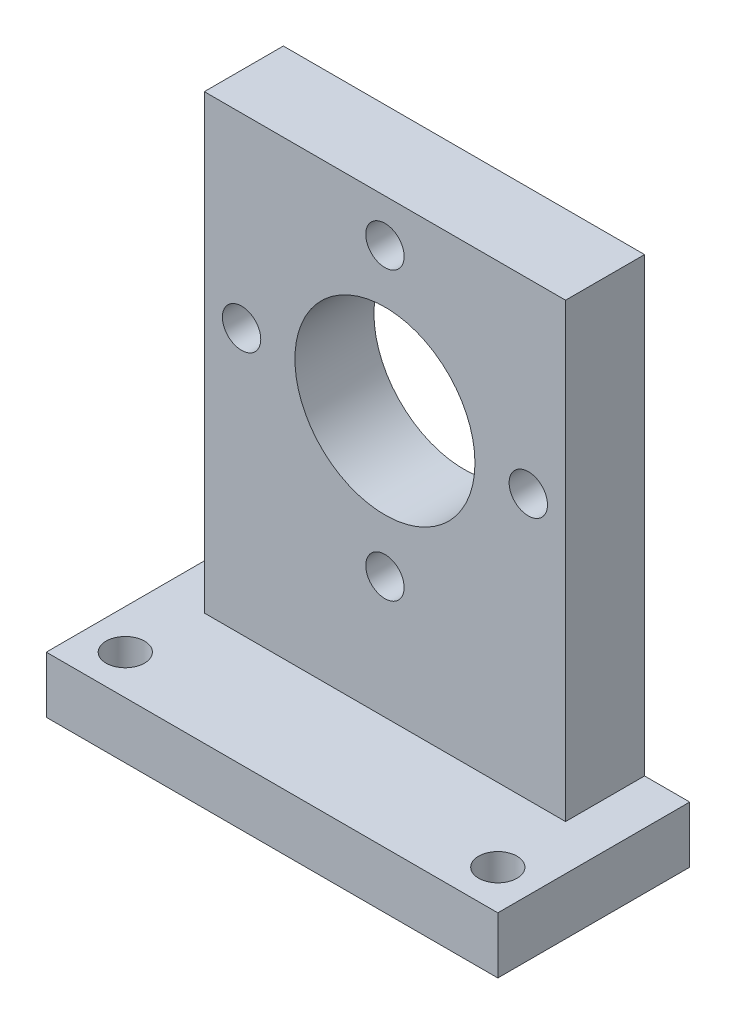
ISO-10303-21;
HEADER;
FILE_DESCRIPTION(('STEP AP214'),'2;1');
FILE_NAME('part.step','',(''),(''),'','','');
FILE_SCHEMA(('AUTOMOTIVE_DESIGN { 1 0 10303 214 1 1 1 1 }'));
ENDSEC;
DATA;
#1=APPLICATION_CONTEXT('core data for automotive mechanical design processes');
#2=APPLICATION_PROTOCOL_DEFINITION('international standard','automotive_design',2000,#1);
#3=PRODUCT_CONTEXT('',#1,'mechanical');
#4=PRODUCT('Part','Part','',(#3));
#5=PRODUCT_RELATED_PRODUCT_CATEGORY('part','',(#4));
#6=PRODUCT_DEFINITION_FORMATION('','',#4);
#7=PRODUCT_DEFINITION_CONTEXT('part definition',#1,'design');
#8=PRODUCT_DEFINITION('design','',#6,#7);
#9=PRODUCT_DEFINITION_SHAPE('','',#8);
#10=(LENGTH_UNIT() NAMED_UNIT(*) SI_UNIT(.MILLI.,.METRE.));
#11=(NAMED_UNIT(*) PLANE_ANGLE_UNIT() SI_UNIT($,.RADIAN.));
#12=(NAMED_UNIT(*) SI_UNIT($,.STERADIAN.) SOLID_ANGLE_UNIT());
#13=UNCERTAINTY_MEASURE_WITH_UNIT(LENGTH_MEASURE(1.E-05),#10,'distance_accuracy_value','');
#14=(GEOMETRIC_REPRESENTATION_CONTEXT(3) GLOBAL_UNCERTAINTY_ASSIGNED_CONTEXT((#13)) GLOBAL_UNIT_ASSIGNED_CONTEXT((#10,
#11,#12)) REPRESENTATION_CONTEXT('',''));
#15=CARTESIAN_POINT('',(0.,0.,0.));
#16=DIRECTION('',(0.,0.,1.));
#17=DIRECTION('',(1.,0.,0.));
#18=AXIS2_PLACEMENT_3D('',#15,#16,#17);
#19=CARTESIAN_POINT('',(-20.,5.,13.5));
#20=DIRECTION('',(0.,0.,-1.));
#21=DIRECTION('',(-1.,0.,0.));
#22=AXIS2_PLACEMENT_3D('',#19,#20,#21);
#23=PLANE('',#22);
#24=DIRECTION('',(1.,0.,0.));
#25=VECTOR('',#24,1.);
#26=CARTESIAN_POINT('',(-20.,0.,13.5));
#27=LINE('',#26,#25);
#28=CARTESIAN_POINT('',(-20.,0.,13.5));
#29=VERTEX_POINT('',#28);
#30=CARTESIAN_POINT('',(20.,0.,13.5));
#31=VERTEX_POINT('',#30);
#32=EDGE_CURVE('E123',#29,#31,#27,.T.);
#33=ORIENTED_EDGE('',*,*,#32,.T.);
#34=DIRECTION('',(0.,-1.,0.));
#35=VECTOR('',#34,1.);
#36=CARTESIAN_POINT('',(20.,5.,13.5));
#37=LINE('',#36,#35);
#38=CARTESIAN_POINT('',(20.,5.,13.5));
#39=VERTEX_POINT('',#38);
#40=EDGE_CURVE('E12',#39,#31,#37,.T.);
#41=ORIENTED_EDGE('',*,*,#40,.F.);
#42=DIRECTION('',(1.,0.,0.));
#43=VECTOR('',#42,1.);
#44=CARTESIAN_POINT('',(-20.,5.,13.5));
#45=LINE('',#44,#43);
#46=CARTESIAN_POINT('',(-20.,5.,13.5));
#47=VERTEX_POINT('',#46);
#48=EDGE_CURVE('E117',#47,#39,#45,.T.);
#49=ORIENTED_EDGE('',*,*,#48,.F.);
#50=DIRECTION('',(0.,-1.,0.));
#51=VECTOR('',#50,1.);
#52=CARTESIAN_POINT('',(-20.,5.,13.5));
#53=LINE('',#52,#51);
#54=EDGE_CURVE('E77',#47,#29,#53,.T.);
#55=ORIENTED_EDGE('',*,*,#54,.T.);
#56=EDGE_LOOP('',(#33,#41,#49,#55));
#57=FACE_BOUND('',#56,.T.);
#58=ADVANCED_FACE('F69',(#57),#23,.F.);
#59=CARTESIAN_POINT('',(20.,5.,-13.5));
#60=DIRECTION('',(1.,0.,0.));
#61=DIRECTION('',(0.,0.,-1.));
#62=AXIS2_PLACEMENT_3D('',#59,#60,#61);
#63=PLANE('',#62);
#64=DIRECTION('',(0.,1.,0.));
#65=VECTOR('',#64,1.);
#66=CARTESIAN_POINT('',(20.,-0.00100000000000013,-3.5));
#67=LINE('',#66,#65);
#68=CARTESIAN_POINT('',(20.,0.,-3.5));
#69=VERTEX_POINT('',#68);
#70=CARTESIAN_POINT('',(20.,5.,-3.5));
#71=VERTEX_POINT('',#70);
#72=EDGE_CURVE('E239',#69,#71,#67,.T.);
#73=ORIENTED_EDGE('',*,*,#72,.T.);
#74=DIRECTION('',(0.,0.,1.));
#75=VECTOR('',#74,1.);
#76=CARTESIAN_POINT('',(20.,5.,-13.5));
#77=LINE('',#76,#75);
#78=EDGE_CURVE('E138',#71,#39,#77,.T.);
#79=ORIENTED_EDGE('',*,*,#78,.T.);
#80=ORIENTED_EDGE('',*,*,#40,.T.);
#81=DIRECTION('',(0.,0.,1.));
#82=VECTOR('',#81,1.);
#83=CARTESIAN_POINT('',(20.,0.,-13.5));
#84=LINE('',#83,#82);
#85=EDGE_CURVE('E118',#69,#31,#84,.T.);
#86=ORIENTED_EDGE('',*,*,#85,.F.);
#87=EDGE_LOOP('',(#73,#79,#80,#86));
#88=FACE_BOUND('',#87,.T.);
#89=ADVANCED_FACE('F283',(#88),#63,.T.);
#90=CARTESIAN_POINT('',(-20.,5.,-13.5));
#91=DIRECTION('',(1.,0.,0.));
#92=DIRECTION('',(0.,0.,-1.));
#93=AXIS2_PLACEMENT_3D('',#90,#91,#92);
#94=PLANE('',#93);
#95=DIRECTION('',(0.,0.,1.));
#96=VECTOR('',#95,1.);
#97=CARTESIAN_POINT('',(-20.,5.,-13.5));
#98=LINE('',#97,#96);
#99=CARTESIAN_POINT('',(-20.,5.,-3.5));
#100=VERTEX_POINT('',#99);
#101=EDGE_CURVE('E92',#100,#47,#98,.T.);
#102=ORIENTED_EDGE('',*,*,#101,.F.);
#103=DIRECTION('',(0.,1.,0.));
#104=VECTOR('',#103,1.);
#105=CARTESIAN_POINT('',(-20.,-0.00100000000000013,-3.5));
#106=LINE('',#105,#104);
#107=CARTESIAN_POINT('',(-20.,0.,-3.5));
#108=VERTEX_POINT('',#107);
#109=EDGE_CURVE('E112',#108,#100,#106,.T.);
#110=ORIENTED_EDGE('',*,*,#109,.F.);
#111=DIRECTION('',(0.,0.,1.));
#112=VECTOR('',#111,1.);
#113=CARTESIAN_POINT('',(-20.,0.,-13.5));
#114=LINE('',#113,#112);
#115=EDGE_CURVE('E106',#108,#29,#114,.T.);
#116=ORIENTED_EDGE('',*,*,#115,.T.);
#117=ORIENTED_EDGE('',*,*,#54,.F.);
#118=EDGE_LOOP('',(#102,#110,#116,#117));
#119=FACE_BOUND('',#118,.T.);
#120=ADVANCED_FACE('F108',(#119),#94,.F.);
#121=CARTESIAN_POINT('',(0.,5.,0.));
#122=DIRECTION('',(0.,-1.,0.));
#123=DIRECTION('',(0.,0.,-1.));
#124=AXIS2_PLACEMENT_3D('',#121,#122,#123);
#125=PLANE('',#124);
#126=CARTESIAN_POINT('',(16.5,5.,10.));
#127=DIRECTION('',(0.,1.,0.));
#128=DIRECTION('',(0.,0.,-1.));
#129=AXIS2_PLACEMENT_3D('',#126,#127,#128);
#130=CIRCLE('',#129,1.7);
#131=CARTESIAN_POINT('',(16.5,5.,8.3));
#132=VERTEX_POINT('',#131);
#133=EDGE_CURVE('E221',#132,#132,#130,.T.);
#134=ORIENTED_EDGE('',*,*,#133,.F.);
#135=EDGE_LOOP('',(#134));
#136=FACE_BOUND('',#135,.T.);
#137=CARTESIAN_POINT('',(-16.5,5.,10.));
#138=DIRECTION('',(0.,1.,0.));
#139=DIRECTION('',(0.,0.,1.));
#140=AXIS2_PLACEMENT_3D('',#137,#138,#139);
#141=CIRCLE('',#140,1.7);
#142=CARTESIAN_POINT('',(-16.5,5.,11.7));
#143=VERTEX_POINT('',#142);
#144=EDGE_CURVE('E230',#143,#143,#141,.T.);
#145=ORIENTED_EDGE('',*,*,#144,.F.);
#146=EDGE_LOOP('',(#145));
#147=FACE_BOUND('',#146,.T.);
#148=ORIENTED_EDGE('',*,*,#78,.F.);
#149=DIRECTION('',(1.,0.,0.));
#150=VECTOR('',#149,1.);
#151=CARTESIAN_POINT('',(-20.,5.,-3.5));
#152=LINE('',#151,#150);
#153=CARTESIAN_POINT('',(16.,5.,-3.5));
#154=VERTEX_POINT('',#153);
#155=EDGE_CURVE('E249',#154,#71,#152,.T.);
#156=ORIENTED_EDGE('',*,*,#155,.F.);
#157=DIRECTION('',(0.,0.,1.));
#158=VECTOR('',#157,1.);
#159=CARTESIAN_POINT('',(16.,5.,0.));
#160=LINE('',#159,#158);
#161=CARTESIAN_POINT('',(16.,5.00000000000001,3.5));
#162=VERTEX_POINT('',#161);
#163=EDGE_CURVE('E145',#154,#162,#160,.T.);
#164=ORIENTED_EDGE('',*,*,#163,.T.);
#165=DIRECTION('',(1.,0.,0.));
#166=VECTOR('',#165,1.);
#167=CARTESIAN_POINT('',(0.,5.,3.5));
#168=LINE('',#167,#166);
#169=CARTESIAN_POINT('',(-16.,5.,3.5));
#170=VERTEX_POINT('',#169);
#171=EDGE_CURVE('E84',#170,#162,#168,.T.);
#172=ORIENTED_EDGE('',*,*,#171,.F.);
#173=DIRECTION('',(0.,0.,1.));
#174=VECTOR('',#173,1.);
#175=CARTESIAN_POINT('',(-16.,5.,0.));
#176=LINE('',#175,#174);
#177=CARTESIAN_POINT('',(-16.,5.,-3.5));
#178=VERTEX_POINT('',#177);
#179=EDGE_CURVE('E133',#178,#170,#176,.T.);
#180=ORIENTED_EDGE('',*,*,#179,.F.);
#181=EDGE_CURVE('E242',#100,#178,#152,.T.);
#182=ORIENTED_EDGE('',*,*,#181,.F.);
#183=ORIENTED_EDGE('',*,*,#101,.T.);
#184=ORIENTED_EDGE('',*,*,#48,.T.);
#185=EDGE_LOOP('',(#148,#156,#164,#172,#180,#182,#183,#184));
#186=FACE_BOUND('',#185,.T.);
#187=ADVANCED_FACE('F284',(#136,#147,#186),#125,.F.);
#188=CARTESIAN_POINT('',(0.,0.,0.));
#189=DIRECTION('',(0.,-1.,0.));
#190=DIRECTION('',(0.,0.,-1.));
#191=AXIS2_PLACEMENT_3D('',#188,#189,#190);
#192=PLANE('',#191);
#193=DIRECTION('',(1.,0.,0.));
#194=VECTOR('',#193,1.);
#195=CARTESIAN_POINT('',(-20.,0.,-3.5));
#196=LINE('',#195,#194);
#197=EDGE_CURVE('E226',#108,#69,#196,.T.);
#198=ORIENTED_EDGE('',*,*,#197,.T.);
#199=ORIENTED_EDGE('',*,*,#85,.T.);
#200=ORIENTED_EDGE('',*,*,#32,.F.);
#201=ORIENTED_EDGE('',*,*,#115,.F.);
#202=EDGE_LOOP('',(#198,#199,#200,#201));
#203=FACE_BOUND('',#202,.T.);
#204=CARTESIAN_POINT('',(16.5,0.,10.));
#205=DIRECTION('',(0.,-1.,0.));
#206=DIRECTION('',(0.,0.,-1.));
#207=AXIS2_PLACEMENT_3D('',#204,#205,#206);
#208=CIRCLE('',#207,1.7);
#209=CARTESIAN_POINT('',(16.5,0.,8.3));
#210=VERTEX_POINT('',#209);
#211=EDGE_CURVE('E225',#210,#210,#208,.F.);
#212=ORIENTED_EDGE('',*,*,#211,.T.);
#213=EDGE_LOOP('',(#212));
#214=FACE_BOUND('',#213,.T.);
#215=CARTESIAN_POINT('',(-16.5,0.,10.));
#216=DIRECTION('',(0.,-1.,0.));
#217=DIRECTION('',(0.,0.,-1.));
#218=AXIS2_PLACEMENT_3D('',#215,#216,#217);
#219=CIRCLE('',#218,1.7);
#220=CARTESIAN_POINT('',(-16.5,0.,8.30000000000001));
#221=VERTEX_POINT('',#220);
#222=EDGE_CURVE('E194',#221,#221,#219,.F.);
#223=ORIENTED_EDGE('',*,*,#222,.T.);
#224=EDGE_LOOP('',(#223));
#225=FACE_BOUND('',#224,.T.);
#226=ADVANCED_FACE('F125',(#203,#214,#225),#192,.T.);
#227=CARTESIAN_POINT('',(0.,45.,-3.5));
#228=DIRECTION('',(0.,0.,-1.));
#229=DIRECTION('',(-1.,0.,0.));
#230=AXIS2_PLACEMENT_3D('',#227,#228,#229);
#231=PLANE('',#230);
#232=CARTESIAN_POINT('',(12.7000000000002,2.5,-3.5));
#233=DIRECTION('',(0.,0.,-1.));
#234=DIRECTION('',(-1.,0.,0.));
#235=AXIS2_PLACEMENT_3D('',#232,#233,#234);
#236=CIRCLE('',#235,1.7);
#237=CARTESIAN_POINT('',(11.0000000000002,2.5,-3.5));
#238=VERTEX_POINT('',#237);
#239=EDGE_CURVE('E258',#238,#238,#236,.T.);
#240=ORIENTED_EDGE('',*,*,#239,.F.);
#241=EDGE_LOOP('',(#240));
#242=FACE_BOUND('',#241,.T.);
#243=CARTESIAN_POINT('',(-12.7000000000002,2.5,-3.5));
#244=DIRECTION('',(0.,0.,-1.));
#245=DIRECTION('',(1.,0.,0.));
#246=AXIS2_PLACEMENT_3D('',#243,#244,#245);
#247=CIRCLE('',#246,1.7);
#248=CARTESIAN_POINT('',(-11.0000000000002,2.5,-3.5));
#249=VERTEX_POINT('',#248);
#250=EDGE_CURVE('E254',#249,#249,#247,.T.);
#251=ORIENTED_EDGE('',*,*,#250,.F.);
#252=EDGE_LOOP('',(#251));
#253=FACE_BOUND('',#252,.T.);
#254=CARTESIAN_POINT('',(0.,41.2,-3.5));
#255=DIRECTION('',(0.,0.,-1.));
#256=DIRECTION('',(-1.,0.,0.));
#257=AXIS2_PLACEMENT_3D('',#254,#255,#256);
#258=CIRCLE('',#257,1.7);
#259=CARTESIAN_POINT('',(-1.7,41.2,-3.5));
#260=VERTEX_POINT('',#259);
#261=EDGE_CURVE('E214',#260,#260,#258,.F.);
#262=ORIENTED_EDGE('',*,*,#261,.T.);
#263=EDGE_LOOP('',(#262));
#264=FACE_BOUND('',#263,.T.);
#265=CARTESIAN_POINT('',(12.7000000000002,28.5000000000001,-3.5));
#266=DIRECTION('',(0.,0.,-1.));
#267=DIRECTION('',(-1.,0.,0.));
#268=AXIS2_PLACEMENT_3D('',#265,#266,#267);
#269=CIRCLE('',#268,1.7);
#270=CARTESIAN_POINT('',(11.0000000000002,28.5000000000001,-3.5));
#271=VERTEX_POINT('',#270);
#272=EDGE_CURVE('E210',#271,#271,#269,.F.);
#273=ORIENTED_EDGE('',*,*,#272,.T.);
#274=EDGE_LOOP('',(#273));
#275=FACE_BOUND('',#274,.T.);
#276=CARTESIAN_POINT('',(2.66516243803523E-13,15.8,-3.5));
#277=DIRECTION('',(0.,0.,-1.));
#278=DIRECTION('',(-1.,0.,0.));
#279=AXIS2_PLACEMENT_3D('',#276,#277,#278);
#280=CIRCLE('',#279,1.7);
#281=CARTESIAN_POINT('',(-1.69999999999973,15.8,-3.5));
#282=VERTEX_POINT('',#281);
#283=EDGE_CURVE('E202',#282,#282,#280,.F.);
#284=ORIENTED_EDGE('',*,*,#283,.T.);
#285=EDGE_LOOP('',(#284));
#286=FACE_BOUND('',#285,.T.);
#287=CARTESIAN_POINT('',(-12.6999999999998,28.5,-3.5));
#288=DIRECTION('',(0.,0.,-1.));
#289=DIRECTION('',(-1.,0.,0.));
#290=AXIS2_PLACEMENT_3D('',#287,#288,#289);
#291=CIRCLE('',#290,1.7);
#292=CARTESIAN_POINT('',(-14.3999999999998,28.5,-3.5));
#293=VERTEX_POINT('',#292);
#294=EDGE_CURVE('E193',#293,#293,#291,.F.);
#295=ORIENTED_EDGE('',*,*,#294,.T.);
#296=EDGE_LOOP('',(#295));
#297=FACE_BOUND('',#296,.T.);
#298=CARTESIAN_POINT('',(0.,28.5,-3.5));
#299=DIRECTION('',(0.,0.,-1.));
#300=DIRECTION('',(-1.,0.,0.));
#301=AXIS2_PLACEMENT_3D('',#298,#299,#300);
#302=CIRCLE('',#301,7.9756);
#303=CARTESIAN_POINT('',(-7.9756,28.5,-3.5));
#304=VERTEX_POINT('',#303);
#305=EDGE_CURVE('E181',#304,#304,#302,.F.);
#306=ORIENTED_EDGE('',*,*,#305,.T.);
#307=EDGE_LOOP('',(#306));
#308=FACE_BOUND('',#307,.T.);
#309=DIRECTION('',(0.,-1.,0.));
#310=VECTOR('',#309,1.);
#311=CARTESIAN_POINT('',(16.,45.,-3.5));
#312=LINE('',#311,#310);
#313=CARTESIAN_POINT('',(16.,45.,-3.5));
#314=VERTEX_POINT('',#313);
#315=EDGE_CURVE('E148',#314,#154,#312,.T.);
#316=ORIENTED_EDGE('',*,*,#315,.T.);
#317=ORIENTED_EDGE('',*,*,#155,.T.);
#318=ORIENTED_EDGE('',*,*,#72,.F.);
#319=ORIENTED_EDGE('',*,*,#197,.F.);
#320=ORIENTED_EDGE('',*,*,#109,.T.);
#321=ORIENTED_EDGE('',*,*,#181,.T.);
#322=DIRECTION('',(0.,-1.,0.));
#323=VECTOR('',#322,1.);
#324=CARTESIAN_POINT('',(-16.,45.,-3.5));
#325=LINE('',#324,#323);
#326=CARTESIAN_POINT('',(-16.,45.,-3.5));
#327=VERTEX_POINT('',#326);
#328=EDGE_CURVE('E152',#327,#178,#325,.T.);
#329=ORIENTED_EDGE('',*,*,#328,.F.);
#330=DIRECTION('',(1.,0.,0.));
#331=VECTOR('',#330,1.);
#332=CARTESIAN_POINT('',(0.,45.,-3.5));
#333=LINE('',#332,#331);
#334=EDGE_CURVE('E172',#327,#314,#333,.T.);
#335=ORIENTED_EDGE('',*,*,#334,.T.);
#336=EDGE_LOOP('',(#316,#317,#318,#319,#320,#321,#329,#335));
#337=FACE_BOUND('',#336,.T.);
#338=ADVANCED_FACE('F273',(#242,#253,#264,#275,#286,#297,#308,#337),#231,.T.);
#339=CARTESIAN_POINT('',(0.,45.,3.5));
#340=DIRECTION('',(0.,0.,-1.));
#341=DIRECTION('',(-1.,0.,0.));
#342=AXIS2_PLACEMENT_3D('',#339,#340,#341);
#343=PLANE('',#342);
#344=CARTESIAN_POINT('',(0.,41.2,3.5));
#345=DIRECTION('',(0.,0.,1.));
#346=DIRECTION('',(1.,0.,0.));
#347=AXIS2_PLACEMENT_3D('',#344,#345,#346);
#348=CIRCLE('',#347,1.7);
#349=CARTESIAN_POINT('',(1.7,41.2,3.5));
#350=VERTEX_POINT('',#349);
#351=EDGE_CURVE('E185',#350,#350,#348,.T.);
#352=ORIENTED_EDGE('',*,*,#351,.F.);
#353=EDGE_LOOP('',(#352));
#354=FACE_BOUND('',#353,.T.);
#355=CARTESIAN_POINT('',(12.7000000000002,28.5000000000001,3.5));
#356=DIRECTION('',(0.,0.,1.));
#357=DIRECTION('',(1.,0.,0.));
#358=AXIS2_PLACEMENT_3D('',#355,#356,#357);
#359=CIRCLE('',#358,1.7);
#360=CARTESIAN_POINT('',(14.4000000000002,28.5000000000001,3.5));
#361=VERTEX_POINT('',#360);
#362=EDGE_CURVE('E206',#361,#361,#359,.T.);
#363=ORIENTED_EDGE('',*,*,#362,.F.);
#364=EDGE_LOOP('',(#363));
#365=FACE_BOUND('',#364,.T.);
#366=CARTESIAN_POINT('',(2.66516243803523E-13,15.8,3.5));
#367=DIRECTION('',(0.,0.,1.));
#368=DIRECTION('',(1.,0.,0.));
#369=AXIS2_PLACEMENT_3D('',#366,#367,#368);
#370=CIRCLE('',#369,1.7);
#371=CARTESIAN_POINT('',(1.70000000000027,15.8,3.5));
#372=VERTEX_POINT('',#371);
#373=EDGE_CURVE('E198',#372,#372,#370,.T.);
#374=ORIENTED_EDGE('',*,*,#373,.F.);
#375=EDGE_LOOP('',(#374));
#376=FACE_BOUND('',#375,.T.);
#377=CARTESIAN_POINT('',(-12.6999999999998,28.5,3.5));
#378=DIRECTION('',(0.,0.,1.));
#379=DIRECTION('',(1.,0.,0.));
#380=AXIS2_PLACEMENT_3D('',#377,#378,#379);
#381=CIRCLE('',#380,1.7);
#382=CARTESIAN_POINT('',(-10.9999999999998,28.5,3.5));
#383=VERTEX_POINT('',#382);
#384=EDGE_CURVE('E189',#383,#383,#381,.T.);
#385=ORIENTED_EDGE('',*,*,#384,.F.);
#386=EDGE_LOOP('',(#385));
#387=FACE_BOUND('',#386,.T.);
#388=CARTESIAN_POINT('',(0.,28.5,3.5));
#389=DIRECTION('',(0.,0.,1.));
#390=DIRECTION('',(1.,0.,0.));
#391=AXIS2_PLACEMENT_3D('',#388,#389,#390);
#392=CIRCLE('',#391,7.9756);
#393=CARTESIAN_POINT('',(7.9756,28.5,3.5));
#394=VERTEX_POINT('',#393);
#395=EDGE_CURVE('E180',#394,#394,#392,.T.);
#396=ORIENTED_EDGE('',*,*,#395,.F.);
#397=EDGE_LOOP('',(#396));
#398=FACE_BOUND('',#397,.T.);
#399=DIRECTION('',(0.,-1.,0.));
#400=VECTOR('',#399,1.);
#401=CARTESIAN_POINT('',(-16.,45.,3.5));
#402=LINE('',#401,#400);
#403=CARTESIAN_POINT('',(-16.,45.,3.5));
#404=VERTEX_POINT('',#403);
#405=EDGE_CURVE('E156',#404,#170,#402,.T.);
#406=ORIENTED_EDGE('',*,*,#405,.T.);
#407=ORIENTED_EDGE('',*,*,#171,.T.);
#408=DIRECTION('',(0.,-1.,0.));
#409=VECTOR('',#408,1.);
#410=CARTESIAN_POINT('',(16.,45.,3.5));
#411=LINE('',#410,#409);
#412=CARTESIAN_POINT('',(16.,45.,3.5));
#413=VERTEX_POINT('',#412);
#414=EDGE_CURVE('E160',#413,#162,#411,.T.);
#415=ORIENTED_EDGE('',*,*,#414,.F.);
#416=DIRECTION('',(1.,0.,0.));
#417=VECTOR('',#416,1.);
#418=CARTESIAN_POINT('',(0.,45.,3.5));
#419=LINE('',#418,#417);
#420=EDGE_CURVE('E164',#404,#413,#419,.T.);
#421=ORIENTED_EDGE('',*,*,#420,.F.);
#422=EDGE_LOOP('',(#406,#407,#415,#421));
#423=FACE_BOUND('',#422,.T.);
#424=ADVANCED_FACE('F334',(#354,#365,#376,#387,#398,#423),#343,.F.);
#425=CARTESIAN_POINT('',(16.,45.,0.));
#426=DIRECTION('',(1.,0.,0.));
#427=DIRECTION('',(0.,0.,-1.));
#428=AXIS2_PLACEMENT_3D('',#425,#426,#427);
#429=PLANE('',#428);
#430=ORIENTED_EDGE('',*,*,#163,.F.);
#431=ORIENTED_EDGE('',*,*,#315,.F.);
#432=DIRECTION('',(0.,0.,1.));
#433=VECTOR('',#432,1.);
#434=CARTESIAN_POINT('',(16.,45.,0.));
#435=LINE('',#434,#433);
#436=EDGE_CURVE('E176',#314,#413,#435,.T.);
#437=ORIENTED_EDGE('',*,*,#436,.T.);
#438=ORIENTED_EDGE('',*,*,#414,.T.);
#439=EDGE_LOOP('',(#430,#431,#437,#438));
#440=FACE_BOUND('',#439,.T.);
#441=ADVANCED_FACE('F328',(#440),#429,.T.);
#442=CARTESIAN_POINT('',(-16.,45.,0.));
#443=DIRECTION('',(1.,0.,0.));
#444=DIRECTION('',(0.,0.,-1.));
#445=AXIS2_PLACEMENT_3D('',#442,#443,#444);
#446=PLANE('',#445);
#447=ORIENTED_EDGE('',*,*,#328,.T.);
#448=ORIENTED_EDGE('',*,*,#179,.T.);
#449=ORIENTED_EDGE('',*,*,#405,.F.);
#450=DIRECTION('',(0.,0.,1.));
#451=VECTOR('',#450,1.);
#452=CARTESIAN_POINT('',(-16.,45.,0.));
#453=LINE('',#452,#451);
#454=EDGE_CURVE('E168',#327,#404,#453,.T.);
#455=ORIENTED_EDGE('',*,*,#454,.F.);
#456=EDGE_LOOP('',(#447,#448,#449,#455));
#457=FACE_BOUND('',#456,.T.);
#458=ADVANCED_FACE('F333',(#457),#446,.F.);
#459=CARTESIAN_POINT('',(0.,45.,0.));
#460=DIRECTION('',(0.,1.,0.));
#461=DIRECTION('',(0.,0.,1.));
#462=AXIS2_PLACEMENT_3D('',#459,#460,#461);
#463=PLANE('',#462);
#464=ORIENTED_EDGE('',*,*,#436,.F.);
#465=ORIENTED_EDGE('',*,*,#334,.F.);
#466=ORIENTED_EDGE('',*,*,#454,.T.);
#467=ORIENTED_EDGE('',*,*,#420,.T.);
#468=EDGE_LOOP('',(#464,#465,#466,#467));
#469=FACE_BOUND('',#468,.T.);
#470=ADVANCED_FACE('F346',(#469),#463,.T.);
#471=CARTESIAN_POINT('',(0.,28.5,-13.501));
#472=DIRECTION('',(0.,0.,1.));
#473=DIRECTION('',(1.,0.,0.));
#474=AXIS2_PLACEMENT_3D('',#471,#472,#473);
#475=CYLINDRICAL_SURFACE('',#474,7.9756);
#476=ORIENTED_EDGE('',*,*,#305,.F.);
#477=EDGE_LOOP('',(#476));
#478=FACE_BOUND('',#477,.T.);
#479=ORIENTED_EDGE('',*,*,#395,.T.);
#480=EDGE_LOOP('',(#479));
#481=FACE_BOUND('',#480,.T.);
#482=ADVANCED_FACE('F464',(#478,#481),#475,.F.);
#483=CARTESIAN_POINT('',(-12.6999999999998,28.5,-13.501));
#484=DIRECTION('',(0.,0.,1.));
#485=DIRECTION('',(1.,0.,0.));
#486=AXIS2_PLACEMENT_3D('',#483,#484,#485);
#487=CYLINDRICAL_SURFACE('',#486,1.7);
#488=ORIENTED_EDGE('',*,*,#294,.F.);
#489=EDGE_LOOP('',(#488));
#490=FACE_BOUND('',#489,.T.);
#491=ORIENTED_EDGE('',*,*,#384,.T.);
#492=EDGE_LOOP('',(#491));
#493=FACE_BOUND('',#492,.T.);
#494=ADVANCED_FACE('F454',(#490,#493),#487,.F.);
#495=CARTESIAN_POINT('',(2.66516243803523E-13,15.8,-13.501));
#496=DIRECTION('',(0.,0.,1.));
#497=DIRECTION('',(1.,0.,0.));
#498=AXIS2_PLACEMENT_3D('',#495,#496,#497);
#499=CYLINDRICAL_SURFACE('',#498,1.7);
#500=ORIENTED_EDGE('',*,*,#283,.F.);
#501=EDGE_LOOP('',(#500));
#502=FACE_BOUND('',#501,.T.);
#503=ORIENTED_EDGE('',*,*,#373,.T.);
#504=EDGE_LOOP('',(#503));
#505=FACE_BOUND('',#504,.T.);
#506=ADVANCED_FACE('F444',(#502,#505),#499,.F.);
#507=CARTESIAN_POINT('',(12.7000000000002,28.5000000000001,-13.501));
#508=DIRECTION('',(0.,0.,1.));
#509=DIRECTION('',(1.,0.,0.));
#510=AXIS2_PLACEMENT_3D('',#507,#508,#509);
#511=CYLINDRICAL_SURFACE('',#510,1.7);
#512=ORIENTED_EDGE('',*,*,#272,.F.);
#513=EDGE_LOOP('',(#512));
#514=FACE_BOUND('',#513,.T.);
#515=ORIENTED_EDGE('',*,*,#362,.T.);
#516=EDGE_LOOP('',(#515));
#517=FACE_BOUND('',#516,.T.);
#518=ADVANCED_FACE('F434',(#514,#517),#511,.F.);
#519=CARTESIAN_POINT('',(0.,41.2,-13.501));
#520=DIRECTION('',(0.,0.,1.));
#521=DIRECTION('',(1.,0.,0.));
#522=AXIS2_PLACEMENT_3D('',#519,#520,#521);
#523=CYLINDRICAL_SURFACE('',#522,1.7);
#524=ORIENTED_EDGE('',*,*,#261,.F.);
#525=EDGE_LOOP('',(#524));
#526=FACE_BOUND('',#525,.T.);
#527=ORIENTED_EDGE('',*,*,#351,.T.);
#528=EDGE_LOOP('',(#527));
#529=FACE_BOUND('',#528,.T.);
#530=ADVANCED_FACE('F424',(#526,#529),#523,.F.);
#531=CARTESIAN_POINT('',(-16.5,-0.00100000000000013,10.));
#532=DIRECTION('',(0.,1.,0.));
#533=DIRECTION('',(0.,0.,1.));
#534=AXIS2_PLACEMENT_3D('',#531,#532,#533);
#535=CYLINDRICAL_SURFACE('',#534,1.7);
#536=ORIENTED_EDGE('',*,*,#222,.F.);
#537=EDGE_LOOP('',(#536));
#538=FACE_BOUND('',#537,.T.);
#539=ORIENTED_EDGE('',*,*,#144,.T.);
#540=EDGE_LOOP('',(#539));
#541=FACE_BOUND('',#540,.T.);
#542=ADVANCED_FACE('F415',(#538,#541),#535,.F.);
#543=CARTESIAN_POINT('',(16.5,-0.00100000000000013,10.));
#544=DIRECTION('',(0.,1.,0.));
#545=DIRECTION('',(0.,0.,1.));
#546=AXIS2_PLACEMENT_3D('',#543,#544,#545);
#547=CYLINDRICAL_SURFACE('',#546,1.7);
#548=ORIENTED_EDGE('',*,*,#211,.F.);
#549=EDGE_LOOP('',(#548));
#550=FACE_BOUND('',#549,.T.);
#551=ORIENTED_EDGE('',*,*,#133,.T.);
#552=EDGE_LOOP('',(#551));
#553=FACE_BOUND('',#552,.T.);
#554=ADVANCED_FACE('F370',(#550,#553),#547,.F.);
#555=CARTESIAN_POINT('',(-12.7000000000002,2.5,2.85));
#556=DIRECTION('',(0.,0.,-1.));
#557=DIRECTION('',(-1.,0.,0.));
#558=AXIS2_PLACEMENT_3D('',#555,#556,#557);
#559=CYLINDRICAL_SURFACE('',#558,1.7);
#560=CARTESIAN_POINT('',(-12.7000000000002,2.5,2.85));
#561=DIRECTION('',(0.,0.,-1.));
#562=DIRECTION('',(1.,0.,0.));
#563=AXIS2_PLACEMENT_3D('',#560,#561,#562);
#564=CIRCLE('',#563,1.7);
#565=CARTESIAN_POINT('',(-11.0000000000002,2.5,2.85));
#566=VERTEX_POINT('',#565);
#567=EDGE_CURVE('E250',#566,#566,#564,.T.);
#568=ORIENTED_EDGE('',*,*,#567,.F.);
#569=EDGE_LOOP('',(#568));
#570=FACE_BOUND('',#569,.T.);
#571=ORIENTED_EDGE('',*,*,#250,.T.);
#572=EDGE_LOOP('',(#571));
#573=FACE_BOUND('',#572,.T.);
#574=ADVANCED_FACE('F365',(#570,#573),#559,.F.);
#575=CARTESIAN_POINT('',(-12.7000000000002,2.5,2.85));
#576=DIRECTION('',(0.,0.,1.));
#577=DIRECTION('',(1.,0.,0.));
#578=AXIS2_PLACEMENT_3D('',#575,#576,#577);
#579=PLANE('',#578);
#580=ORIENTED_EDGE('',*,*,#567,.T.);
#581=EDGE_LOOP('',(#580));
#582=FACE_BOUND('',#581,.T.);
#583=ADVANCED_FACE('F369',(#582),#579,.F.);
#584=CARTESIAN_POINT('',(12.7000000000002,2.5,2.85));
#585=DIRECTION('',(0.,0.,-1.));
#586=DIRECTION('',(-1.,0.,0.));
#587=AXIS2_PLACEMENT_3D('',#584,#585,#586);
#588=CYLINDRICAL_SURFACE('',#587,1.7);
#589=CARTESIAN_POINT('',(12.7000000000002,2.5,2.85));
#590=DIRECTION('',(0.,0.,-1.));
#591=DIRECTION('',(-1.,0.,0.));
#592=AXIS2_PLACEMENT_3D('',#589,#590,#591);
#593=CIRCLE('',#592,1.7);
#594=CARTESIAN_POINT('',(11.0000000000002,2.5,2.85));
#595=VERTEX_POINT('',#594);
#596=EDGE_CURVE('E262',#595,#595,#593,.T.);
#597=ORIENTED_EDGE('',*,*,#596,.F.);
#598=EDGE_LOOP('',(#597));
#599=FACE_BOUND('',#598,.T.);
#600=ORIENTED_EDGE('',*,*,#239,.T.);
#601=EDGE_LOOP('',(#600));
#602=FACE_BOUND('',#601,.T.);
#603=ADVANCED_FACE('F382',(#599,#602),#588,.F.);
#604=CARTESIAN_POINT('',(12.7000000000002,2.5,2.85));
#605=DIRECTION('',(0.,0.,-1.));
#606=DIRECTION('',(-1.,0.,0.));
#607=AXIS2_PLACEMENT_3D('',#604,#605,#606);
#608=PLANE('',#607);
#609=ORIENTED_EDGE('',*,*,#596,.T.);
#610=EDGE_LOOP('',(#609));
#611=FACE_BOUND('',#610,.T.);
#612=ADVANCED_FACE('F393',(#611),#608,.T.);
#613=CLOSED_SHELL('',(#58,#89,#120,#187,#226,#338,#424,#441,#458,#470,#482,#494,#506,#518,#530,
#542,#554,#574,#583,#603,#612));
#614=MANIFOLD_SOLID_BREP('B2',#613);
#615=ADVANCED_BREP_SHAPE_REPRESENTATION('',(#18,#614),#14);
#616=SHAPE_DEFINITION_REPRESENTATION(#9,#615);
ENDSEC;
END-ISO-10303-21;
